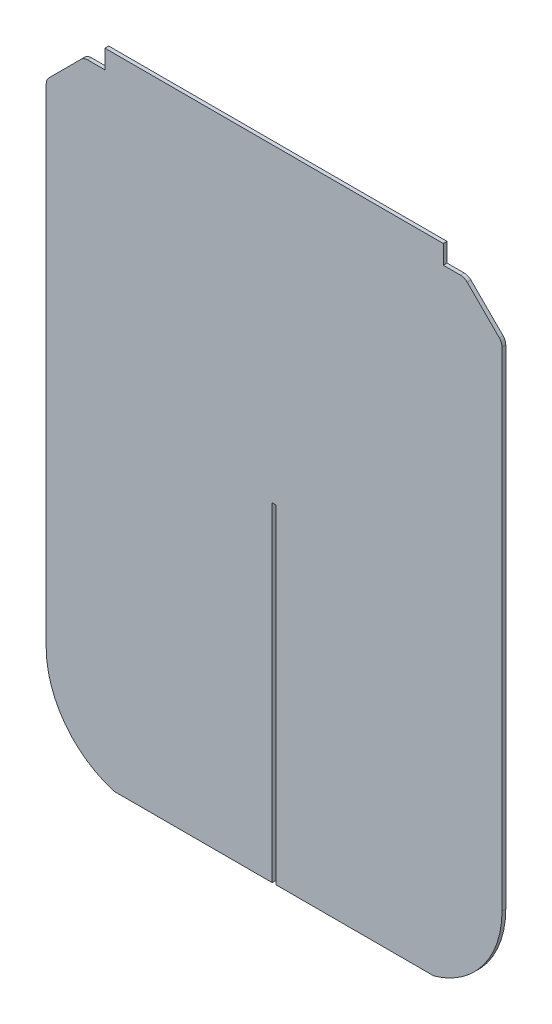
ISO-10303-21;
HEADER;
FILE_DESCRIPTION(('STEP AP214'),'2;1');
FILE_NAME('part.step','',(''),(''),'','','');
FILE_SCHEMA(('AUTOMOTIVE_DESIGN { 1 0 10303 214 1 1 1 1 }'));
ENDSEC;
DATA;
#1=APPLICATION_CONTEXT('core data for automotive mechanical design processes');
#2=APPLICATION_PROTOCOL_DEFINITION('international standard','automotive_design',2000,#1);
#3=PRODUCT_CONTEXT('',#1,'mechanical');
#4=PRODUCT('Part','Part','',(#3));
#5=PRODUCT_RELATED_PRODUCT_CATEGORY('part','',(#4));
#6=PRODUCT_DEFINITION_FORMATION('','',#4);
#7=PRODUCT_DEFINITION_CONTEXT('part definition',#1,'design');
#8=PRODUCT_DEFINITION('design','',#6,#7);
#9=PRODUCT_DEFINITION_SHAPE('','',#8);
#10=(LENGTH_UNIT() NAMED_UNIT(*) SI_UNIT(.MILLI.,.METRE.));
#11=(NAMED_UNIT(*) PLANE_ANGLE_UNIT() SI_UNIT($,.RADIAN.));
#12=(NAMED_UNIT(*) SI_UNIT($,.STERADIAN.) SOLID_ANGLE_UNIT());
#13=UNCERTAINTY_MEASURE_WITH_UNIT(LENGTH_MEASURE(1.E-05),#10,'distance_accuracy_value','');
#14=(GEOMETRIC_REPRESENTATION_CONTEXT(3) GLOBAL_UNCERTAINTY_ASSIGNED_CONTEXT((#13)) GLOBAL_UNIT_ASSIGNED_CONTEXT((#10,
#11,#12)) REPRESENTATION_CONTEXT('',''));
#15=CARTESIAN_POINT('',(0.,0.,0.));
#16=DIRECTION('',(0.,0.,1.));
#17=DIRECTION('',(1.,0.,0.));
#18=AXIS2_PLACEMENT_3D('',#15,#16,#17);
#19=CARTESIAN_POINT('',(12.5,132.,0.8));
#20=DIRECTION('',(1.,0.,0.));
#21=DIRECTION('',(0.,0.,-1.));
#22=AXIS2_PLACEMENT_3D('',#19,#20,#21);
#23=PLANE('',#22);
#24=DIRECTION('',(0.,-1.,0.));
#25=VECTOR('',#24,1.);
#26=CARTESIAN_POINT('',(12.5,132.,0.));
#27=LINE('',#26,#25);
#28=CARTESIAN_POINT('',(12.5,136.,0.));
#29=VERTEX_POINT('',#28);
#30=CARTESIAN_POINT('',(12.5,132.,0.));
#31=VERTEX_POINT('',#30);
#32=EDGE_CURVE('E208',#29,#31,#27,.T.);
#33=ORIENTED_EDGE('',*,*,#32,.T.);
#34=DIRECTION('',(0.,0.,-1.));
#35=VECTOR('',#34,1.);
#36=CARTESIAN_POINT('',(12.5,132.,0.8));
#37=LINE('',#36,#35);
#38=CARTESIAN_POINT('',(12.5,132.,0.8));
#39=VERTEX_POINT('',#38);
#40=EDGE_CURVE('E188',#39,#31,#37,.T.);
#41=ORIENTED_EDGE('',*,*,#40,.F.);
#42=DIRECTION('',(0.,-1.,0.));
#43=VECTOR('',#42,1.);
#44=CARTESIAN_POINT('',(12.5,132.,0.8));
#45=LINE('',#44,#43);
#46=CARTESIAN_POINT('',(12.5,136.,0.8));
#47=VERTEX_POINT('',#46);
#48=EDGE_CURVE('E195',#47,#39,#45,.T.);
#49=ORIENTED_EDGE('',*,*,#48,.F.);
#50=DIRECTION('',(0.,0.,-1.));
#51=VECTOR('',#50,1.);
#52=CARTESIAN_POINT('',(12.5,136.,0.8));
#53=LINE('',#52,#51);
#54=EDGE_CURVE('E292',#47,#29,#53,.T.);
#55=ORIENTED_EDGE('',*,*,#54,.T.);
#56=EDGE_LOOP('',(#33,#41,#49,#55));
#57=FACE_BOUND('',#56,.T.);
#58=ADVANCED_FACE('F45',(#57),#23,.F.);
#59=CARTESIAN_POINT('',(8.,132.,0.8));
#60=DIRECTION('',(0.,-1.,0.));
#61=DIRECTION('',(0.,0.,-1.));
#62=AXIS2_PLACEMENT_3D('',#59,#60,#61);
#63=PLANE('',#62);
#64=DIRECTION('',(-1.,0.,0.));
#65=VECTOR('',#64,1.);
#66=CARTESIAN_POINT('',(8.,132.,0.));
#67=LINE('',#66,#65);
#68=CARTESIAN_POINT('',(8.82842712474618,132.,0.));
#69=VERTEX_POINT('',#68);
#70=EDGE_CURVE('E395',#31,#69,#67,.T.);
#71=ORIENTED_EDGE('',*,*,#70,.T.);
#72=DIRECTION('',(0.,0.,-1.));
#73=VECTOR('',#72,1.);
#74=CARTESIAN_POINT('',(8.82842712474618,132.,0.8));
#75=LINE('',#74,#73);
#76=CARTESIAN_POINT('',(8.82842712474618,132.,0.8));
#77=VERTEX_POINT('',#76);
#78=EDGE_CURVE('E191',#69,#77,#75,.F.);
#79=ORIENTED_EDGE('',*,*,#78,.T.);
#80=DIRECTION('',(-1.,0.,0.));
#81=VECTOR('',#80,1.);
#82=CARTESIAN_POINT('',(8.,132.,0.8));
#83=LINE('',#82,#81);
#84=EDGE_CURVE('E183',#39,#77,#83,.T.);
#85=ORIENTED_EDGE('',*,*,#84,.F.);
#86=ORIENTED_EDGE('',*,*,#40,.T.);
#87=EDGE_LOOP('',(#71,#79,#85,#86));
#88=FACE_BOUND('',#87,.T.);
#89=ADVANCED_FACE('F186',(#88),#63,.F.);
#90=CARTESIAN_POINT('',(0.,124.,0.8));
#91=DIRECTION('',(0.707106781186548,-0.707106781186547,0.));
#92=DIRECTION('',(0.707106781186547,0.707106781186548,0.));
#93=AXIS2_PLACEMENT_3D('',#90,#91,#92);
#94=PLANE('',#93);
#95=DIRECTION('',(-0.707106781186547,-0.707106781186548,0.));
#96=VECTOR('',#95,1.);
#97=CARTESIAN_POINT('',(0.,124.,0.8));
#98=LINE('',#97,#96);
#99=CARTESIAN_POINT('',(7.41421356237309,131.414213562373,0.8));
#100=VERTEX_POINT('',#99);
#101=CARTESIAN_POINT('',(0.585786437626899,124.585786437627,0.8));
#102=VERTEX_POINT('',#101);
#103=EDGE_CURVE('E194',#100,#102,#98,.T.);
#104=ORIENTED_EDGE('',*,*,#103,.F.);
#105=DIRECTION('',(0.,0.,-1.));
#106=VECTOR('',#105,1.);
#107=CARTESIAN_POINT('',(7.41421356237309,131.414213562373,0.8));
#108=LINE('',#107,#106);
#109=CARTESIAN_POINT('',(7.41421356237309,131.414213562373,0.));
#110=VERTEX_POINT('',#109);
#111=EDGE_CURVE('E215',#100,#110,#108,.T.);
#112=ORIENTED_EDGE('',*,*,#111,.T.);
#113=DIRECTION('',(-0.707106781186547,-0.707106781186548,0.));
#114=VECTOR('',#113,1.);
#115=CARTESIAN_POINT('',(0.,124.,0.));
#116=LINE('',#115,#114);
#117=CARTESIAN_POINT('',(0.585786437626899,124.585786437627,0.));
#118=VERTEX_POINT('',#117);
#119=EDGE_CURVE('E398',#110,#118,#116,.T.);
#120=ORIENTED_EDGE('',*,*,#119,.T.);
#121=DIRECTION('',(0.,0.,-1.));
#122=VECTOR('',#121,1.);
#123=CARTESIAN_POINT('',(0.5857864376269,124.585786437627,0.8));
#124=LINE('',#123,#122);
#125=EDGE_CURVE('E210',#118,#102,#124,.F.);
#126=ORIENTED_EDGE('',*,*,#125,.T.);
#127=EDGE_LOOP('',(#104,#112,#120,#126));
#128=FACE_BOUND('',#127,.T.);
#129=ADVANCED_FACE('F457',(#128),#94,.F.);
#130=CARTESIAN_POINT('',(0.,19.2288845230294,0.8));
#131=DIRECTION('',(1.,0.,0.));
#132=DIRECTION('',(0.,0.,-1.));
#133=AXIS2_PLACEMENT_3D('',#130,#131,#132);
#134=PLANE('',#133);
#135=DIRECTION('',(0.,-1.,0.));
#136=VECTOR('',#135,1.);
#137=CARTESIAN_POINT('',(0.,19.2288845230294,0.8));
#138=LINE('',#137,#136);
#139=CARTESIAN_POINT('',(0.,123.171572875254,0.8));
#140=VERTEX_POINT('',#139);
#141=CARTESIAN_POINT('',(0.,19.2288845230294,0.8));
#142=VERTEX_POINT('',#141);
#143=EDGE_CURVE('E410',#140,#142,#138,.T.);
#144=ORIENTED_EDGE('',*,*,#143,.F.);
#145=DIRECTION('',(0.,0.,-1.));
#146=VECTOR('',#145,1.);
#147=CARTESIAN_POINT('',(0.,123.171572875254,0.8));
#148=LINE('',#147,#146);
#149=CARTESIAN_POINT('',(0.,123.171572875254,0.));
#150=VERTEX_POINT('',#149);
#151=EDGE_CURVE('E250',#140,#150,#148,.T.);
#152=ORIENTED_EDGE('',*,*,#151,.T.);
#153=DIRECTION('',(0.,-1.,0.));
#154=VECTOR('',#153,1.);
#155=CARTESIAN_POINT('',(0.,19.2288845230294,0.));
#156=LINE('',#155,#154);
#157=CARTESIAN_POINT('',(0.,19.2288845230294,0.));
#158=VERTEX_POINT('',#157);
#159=EDGE_CURVE('E350',#150,#158,#156,.T.);
#160=ORIENTED_EDGE('',*,*,#159,.T.);
#161=DIRECTION('',(0.,0.,-1.));
#162=VECTOR('',#161,1.);
#163=CARTESIAN_POINT('',(0.,19.2288845230294,0.8));
#164=LINE('',#163,#162);
#165=EDGE_CURVE('E211',#142,#158,#164,.T.);
#166=ORIENTED_EDGE('',*,*,#165,.F.);
#167=EDGE_LOOP('',(#144,#152,#160,#166));
#168=FACE_BOUND('',#167,.T.);
#169=ADVANCED_FACE('F405',(#168),#134,.F.);
#170=CARTESIAN_POINT('',(20.,19.2288845230294,0.8));
#171=DIRECTION('',(0.,0.,-1.));
#172=DIRECTION('',(-1.,0.,0.));
#173=AXIS2_PLACEMENT_3D('',#170,#171,#172);
#174=CYLINDRICAL_SURFACE('',#173,20.);
#175=CARTESIAN_POINT('',(20.,19.2288845230294,0.));
#176=DIRECTION('',(0.,0.,1.));
#177=DIRECTION('',(1.,0.,0.));
#178=AXIS2_PLACEMENT_3D('',#175,#176,#177);
#179=CIRCLE('',#178,20.);
#180=CARTESIAN_POINT('',(14.5,0.,0.));
#181=VERTEX_POINT('',#180);
#182=EDGE_CURVE('E341',#158,#181,#179,.T.);
#183=ORIENTED_EDGE('',*,*,#182,.T.);
#184=DIRECTION('',(0.,0.,-1.));
#185=VECTOR('',#184,1.);
#186=CARTESIAN_POINT('',(14.5,0.,0.8));
#187=LINE('',#186,#185);
#188=CARTESIAN_POINT('',(14.5,0.,0.8));
#189=VERTEX_POINT('',#188);
#190=EDGE_CURVE('E218',#189,#181,#187,.T.);
#191=ORIENTED_EDGE('',*,*,#190,.F.);
#192=CARTESIAN_POINT('',(20.,19.2288845230294,0.8));
#193=DIRECTION('',(0.,0.,1.));
#194=DIRECTION('',(1.,0.,0.));
#195=AXIS2_PLACEMENT_3D('',#192,#193,#194);
#196=CIRCLE('',#195,20.);
#197=EDGE_CURVE('E408',#142,#189,#196,.T.);
#198=ORIENTED_EDGE('',*,*,#197,.F.);
#199=ORIENTED_EDGE('',*,*,#165,.T.);
#200=EDGE_LOOP('',(#183,#191,#198,#199));
#201=FACE_BOUND('',#200,.T.);
#202=ADVANCED_FACE('F407',(#201),#174,.T.);
#203=CARTESIAN_POINT('',(14.5,0.,0.8));
#204=DIRECTION('',(0.,1.,0.));
#205=DIRECTION('',(0.,0.,1.));
#206=AXIS2_PLACEMENT_3D('',#203,#204,#205);
#207=PLANE('',#206);
#208=DIRECTION('',(1.,0.,0.));
#209=VECTOR('',#208,1.);
#210=CARTESIAN_POINT('',(14.5,0.,0.));
#211=LINE('',#210,#209);
#212=CARTESIAN_POINT('',(48.1,0.,0.));
#213=VERTEX_POINT('',#212);
#214=EDGE_CURVE('E334',#181,#213,#211,.T.);
#215=ORIENTED_EDGE('',*,*,#214,.T.);
#216=DIRECTION('',(0.,0.,-1.));
#217=VECTOR('',#216,1.);
#218=CARTESIAN_POINT('',(48.1,0.,0.8));
#219=LINE('',#218,#217);
#220=CARTESIAN_POINT('',(48.1,0.,0.8));
#221=VERTEX_POINT('',#220);
#222=EDGE_CURVE('E323',#221,#213,#219,.T.);
#223=ORIENTED_EDGE('',*,*,#222,.F.);
#224=DIRECTION('',(1.,0.,0.));
#225=VECTOR('',#224,1.);
#226=CARTESIAN_POINT('',(14.5,0.,0.8));
#227=LINE('',#226,#225);
#228=EDGE_CURVE('E335',#189,#221,#227,.T.);
#229=ORIENTED_EDGE('',*,*,#228,.F.);
#230=ORIENTED_EDGE('',*,*,#190,.T.);
#231=EDGE_LOOP('',(#215,#223,#229,#230));
#232=FACE_BOUND('',#231,.T.);
#233=ADVANCED_FACE('F332',(#232),#207,.F.);
#234=CARTESIAN_POINT('',(48.1,70.,0.8));
#235=DIRECTION('',(-1.,0.,0.));
#236=DIRECTION('',(0.,-1.,0.));
#237=AXIS2_PLACEMENT_3D('',#234,#235,#236);
#238=PLANE('',#237);
#239=DIRECTION('',(0.,1.,0.));
#240=VECTOR('',#239,1.);
#241=CARTESIAN_POINT('',(48.1,70.,0.));
#242=LINE('',#241,#240);
#243=CARTESIAN_POINT('',(48.1,70.,0.));
#244=VERTEX_POINT('',#243);
#245=EDGE_CURVE('E343',#213,#244,#242,.T.);
#246=ORIENTED_EDGE('',*,*,#245,.T.);
#247=DIRECTION('',(0.,0.,-1.));
#248=VECTOR('',#247,1.);
#249=CARTESIAN_POINT('',(48.1,70.,0.8));
#250=LINE('',#249,#248);
#251=CARTESIAN_POINT('',(48.1,70.,0.8));
#252=VERTEX_POINT('',#251);
#253=EDGE_CURVE('E319',#252,#244,#250,.T.);
#254=ORIENTED_EDGE('',*,*,#253,.F.);
#255=DIRECTION('',(0.,1.,0.));
#256=VECTOR('',#255,1.);
#257=CARTESIAN_POINT('',(48.1,70.,0.8));
#258=LINE('',#257,#256);
#259=EDGE_CURVE('E414',#221,#252,#258,.T.);
#260=ORIENTED_EDGE('',*,*,#259,.F.);
#261=ORIENTED_EDGE('',*,*,#222,.T.);
#262=EDGE_LOOP('',(#246,#254,#260,#261));
#263=FACE_BOUND('',#262,.T.);
#264=ADVANCED_FACE('F442',(#263),#238,.F.);
#265=CARTESIAN_POINT('',(48.1,70.,0.8));
#266=DIRECTION('',(0.,1.,0.));
#267=DIRECTION('',(0.,0.,1.));
#268=AXIS2_PLACEMENT_3D('',#265,#266,#267);
#269=PLANE('',#268);
#270=DIRECTION('',(1.,0.,0.));
#271=VECTOR('',#270,1.);
#272=CARTESIAN_POINT('',(48.1,70.,0.));
#273=LINE('',#272,#271);
#274=CARTESIAN_POINT('',(48.9,70.,0.));
#275=VERTEX_POINT('',#274);
#276=EDGE_CURVE('E348',#244,#275,#273,.T.);
#277=ORIENTED_EDGE('',*,*,#276,.T.);
#278=DIRECTION('',(0.,0.,-1.));
#279=VECTOR('',#278,1.);
#280=CARTESIAN_POINT('',(48.9,70.,0.8));
#281=LINE('',#280,#279);
#282=CARTESIAN_POINT('',(48.9,70.,0.8));
#283=VERTEX_POINT('',#282);
#284=EDGE_CURVE('E315',#283,#275,#281,.T.);
#285=ORIENTED_EDGE('',*,*,#284,.F.);
#286=DIRECTION('',(1.,0.,0.));
#287=VECTOR('',#286,1.);
#288=CARTESIAN_POINT('',(48.1,70.,0.8));
#289=LINE('',#288,#287);
#290=EDGE_CURVE('E421',#252,#283,#289,.T.);
#291=ORIENTED_EDGE('',*,*,#290,.F.);
#292=ORIENTED_EDGE('',*,*,#253,.T.);
#293=EDGE_LOOP('',(#277,#285,#291,#292));
#294=FACE_BOUND('',#293,.T.);
#295=ADVANCED_FACE('F438',(#294),#269,.F.);
#296=CARTESIAN_POINT('',(48.9,70.,0.8));
#297=DIRECTION('',(1.,0.,0.));
#298=DIRECTION('',(0.,1.,0.));
#299=AXIS2_PLACEMENT_3D('',#296,#297,#298);
#300=PLANE('',#299);
#301=DIRECTION('',(0.,-1.,0.));
#302=VECTOR('',#301,1.);
#303=CARTESIAN_POINT('',(48.9,70.,0.));
#304=LINE('',#303,#302);
#305=CARTESIAN_POINT('',(48.9,0.,0.));
#306=VERTEX_POINT('',#305);
#307=EDGE_CURVE('E356',#275,#306,#304,.T.);
#308=ORIENTED_EDGE('',*,*,#307,.T.);
#309=DIRECTION('',(0.,0.,-1.));
#310=VECTOR('',#309,1.);
#311=CARTESIAN_POINT('',(48.9,0.,0.8));
#312=LINE('',#311,#310);
#313=CARTESIAN_POINT('',(48.9,0.,0.8));
#314=VERTEX_POINT('',#313);
#315=EDGE_CURVE('E311',#314,#306,#312,.T.);
#316=ORIENTED_EDGE('',*,*,#315,.F.);
#317=DIRECTION('',(0.,-1.,0.));
#318=VECTOR('',#317,1.);
#319=CARTESIAN_POINT('',(48.9,70.,0.8));
#320=LINE('',#319,#318);
#321=EDGE_CURVE('E424',#283,#314,#320,.T.);
#322=ORIENTED_EDGE('',*,*,#321,.F.);
#323=ORIENTED_EDGE('',*,*,#284,.T.);
#324=EDGE_LOOP('',(#308,#316,#322,#323));
#325=FACE_BOUND('',#324,.T.);
#326=ADVANCED_FACE('F434',(#325),#300,.F.);
#327=CARTESIAN_POINT('',(48.9,0.,0.8));
#328=DIRECTION('',(0.,1.,0.));
#329=DIRECTION('',(0.,0.,1.));
#330=AXIS2_PLACEMENT_3D('',#327,#328,#329);
#331=PLANE('',#330);
#332=DIRECTION('',(1.,0.,0.));
#333=VECTOR('',#332,1.);
#334=CARTESIAN_POINT('',(48.9,0.,0.));
#335=LINE('',#334,#333);
#336=CARTESIAN_POINT('',(82.5,0.,0.));
#337=VERTEX_POINT('',#336);
#338=EDGE_CURVE('E359',#306,#337,#335,.T.);
#339=ORIENTED_EDGE('',*,*,#338,.T.);
#340=DIRECTION('',(0.,0.,-1.));
#341=VECTOR('',#340,1.);
#342=CARTESIAN_POINT('',(82.5,0.,0.8));
#343=LINE('',#342,#341);
#344=CARTESIAN_POINT('',(82.5,0.,0.8));
#345=VERTEX_POINT('',#344);
#346=EDGE_CURVE('E307',#345,#337,#343,.T.);
#347=ORIENTED_EDGE('',*,*,#346,.F.);
#348=DIRECTION('',(1.,0.,0.));
#349=VECTOR('',#348,1.);
#350=CARTESIAN_POINT('',(48.9,0.,0.8));
#351=LINE('',#350,#349);
#352=EDGE_CURVE('E382',#314,#345,#351,.T.);
#353=ORIENTED_EDGE('',*,*,#352,.F.);
#354=ORIENTED_EDGE('',*,*,#315,.T.);
#355=EDGE_LOOP('',(#339,#347,#353,#354));
#356=FACE_BOUND('',#355,.T.);
#357=ADVANCED_FACE('F431',(#356),#331,.F.);
#358=CARTESIAN_POINT('',(77.,19.2288845230294,0.8));
#359=DIRECTION('',(0.,0.,-1.));
#360=DIRECTION('',(-1.,0.,0.));
#361=AXIS2_PLACEMENT_3D('',#358,#359,#360);
#362=CYLINDRICAL_SURFACE('',#361,20.);
#363=CARTESIAN_POINT('',(77.,19.2288845230294,0.));
#364=DIRECTION('',(0.,0.,1.));
#365=DIRECTION('',(1.,0.,0.));
#366=AXIS2_PLACEMENT_3D('',#363,#364,#365);
#367=CIRCLE('',#366,20.);
#368=CARTESIAN_POINT('',(97.,19.2288845230294,0.));
#369=VERTEX_POINT('',#368);
#370=EDGE_CURVE('E283',#337,#369,#367,.T.);
#371=ORIENTED_EDGE('',*,*,#370,.T.);
#372=DIRECTION('',(0.,0.,-1.));
#373=VECTOR('',#372,1.);
#374=CARTESIAN_POINT('',(97.,19.2288845230294,0.8));
#375=LINE('',#374,#373);
#376=CARTESIAN_POINT('',(97.,19.2288845230294,0.8));
#377=VERTEX_POINT('',#376);
#378=EDGE_CURVE('E303',#377,#369,#375,.T.);
#379=ORIENTED_EDGE('',*,*,#378,.F.);
#380=CARTESIAN_POINT('',(77.,19.2288845230294,0.8));
#381=DIRECTION('',(0.,0.,1.));
#382=DIRECTION('',(1.,0.,0.));
#383=AXIS2_PLACEMENT_3D('',#380,#381,#382);
#384=CIRCLE('',#383,20.);
#385=EDGE_CURVE('E376',#345,#377,#384,.T.);
#386=ORIENTED_EDGE('',*,*,#385,.F.);
#387=ORIENTED_EDGE('',*,*,#346,.T.);
#388=EDGE_LOOP('',(#371,#379,#386,#387));
#389=FACE_BOUND('',#388,.T.);
#390=ADVANCED_FACE('F365',(#389),#362,.T.);
#391=CARTESIAN_POINT('',(97.,19.2288845230294,0.8));
#392=DIRECTION('',(-1.,0.,0.));
#393=DIRECTION('',(0.,-1.,0.));
#394=AXIS2_PLACEMENT_3D('',#391,#392,#393);
#395=PLANE('',#394);
#396=DIRECTION('',(0.,1.,0.));
#397=VECTOR('',#396,1.);
#398=CARTESIAN_POINT('',(97.,19.2288845230294,0.));
#399=LINE('',#398,#397);
#400=CARTESIAN_POINT('',(97.,123.171572875254,0.));
#401=VERTEX_POINT('',#400);
#402=EDGE_CURVE('E277',#369,#401,#399,.T.);
#403=ORIENTED_EDGE('',*,*,#402,.T.);
#404=DIRECTION('',(0.,0.,-1.));
#405=VECTOR('',#404,1.);
#406=CARTESIAN_POINT('',(97.,123.171572875254,0.8));
#407=LINE('',#406,#405);
#408=CARTESIAN_POINT('',(97.,123.171572875254,0.8));
#409=VERTEX_POINT('',#408);
#410=EDGE_CURVE('E11',#401,#409,#407,.F.);
#411=ORIENTED_EDGE('',*,*,#410,.T.);
#412=DIRECTION('',(0.,1.,0.));
#413=VECTOR('',#412,1.);
#414=CARTESIAN_POINT('',(97.,19.2288845230294,0.8));
#415=LINE('',#414,#413);
#416=EDGE_CURVE('E374',#377,#409,#415,.T.);
#417=ORIENTED_EDGE('',*,*,#416,.F.);
#418=ORIENTED_EDGE('',*,*,#378,.T.);
#419=EDGE_LOOP('',(#403,#411,#417,#418));
#420=FACE_BOUND('',#419,.T.);
#421=ADVANCED_FACE('F371',(#420),#395,.F.);
#422=CARTESIAN_POINT('',(97.,124.,0.8));
#423=DIRECTION('',(-0.707106781186548,-0.707106781186548,0.));
#424=DIRECTION('',(0.707106781186548,-0.707106781186548,0.));
#425=AXIS2_PLACEMENT_3D('',#422,#423,#424);
#426=PLANE('',#425);
#427=DIRECTION('',(-0.707106781186547,0.707106781186547,0.));
#428=VECTOR('',#427,1.);
#429=CARTESIAN_POINT('',(97.,124.,0.));
#430=LINE('',#429,#428);
#431=CARTESIAN_POINT('',(96.4142135623731,124.585786437627,0.));
#432=VERTEX_POINT('',#431);
#433=CARTESIAN_POINT('',(89.5857864376269,131.414213562373,0.));
#434=VERTEX_POINT('',#433);
#435=EDGE_CURVE('E265',#432,#434,#430,.T.);
#436=ORIENTED_EDGE('',*,*,#435,.T.);
#437=DIRECTION('',(0.,0.,-1.));
#438=VECTOR('',#437,1.);
#439=CARTESIAN_POINT('',(89.5857864376269,131.414213562373,0.8));
#440=LINE('',#439,#438);
#441=CARTESIAN_POINT('',(89.5857864376269,131.414213562373,0.8));
#442=VERTEX_POINT('',#441);
#443=EDGE_CURVE('E54',#434,#442,#440,.F.);
#444=ORIENTED_EDGE('',*,*,#443,.T.);
#445=DIRECTION('',(-0.707106781186547,0.707106781186547,0.));
#446=VECTOR('',#445,1.);
#447=CARTESIAN_POINT('',(97.,124.,0.8));
#448=LINE('',#447,#446);
#449=CARTESIAN_POINT('',(96.4142135623731,124.585786437627,0.8));
#450=VERTEX_POINT('',#449);
#451=EDGE_CURVE('E266',#450,#442,#448,.T.);
#452=ORIENTED_EDGE('',*,*,#451,.F.);
#453=DIRECTION('',(0.,0.,-1.));
#454=VECTOR('',#453,1.);
#455=CARTESIAN_POINT('',(96.4142135623731,124.585786437627,0.8));
#456=LINE('',#455,#454);
#457=EDGE_CURVE('E258',#450,#432,#456,.T.);
#458=ORIENTED_EDGE('',*,*,#457,.T.);
#459=EDGE_LOOP('',(#436,#444,#452,#458));
#460=FACE_BOUND('',#459,.T.);
#461=ADVANCED_FACE('F264',(#460),#426,.F.);
#462=CARTESIAN_POINT('',(84.5,132.,0.8));
#463=DIRECTION('',(0.,-1.,0.));
#464=DIRECTION('',(0.,0.,-1.));
#465=AXIS2_PLACEMENT_3D('',#462,#463,#464);
#466=PLANE('',#465);
#467=DIRECTION('',(-1.,0.,0.));
#468=VECTOR('',#467,1.);
#469=CARTESIAN_POINT('',(84.5,132.,0.8));
#470=LINE('',#469,#468);
#471=CARTESIAN_POINT('',(88.1715728752538,132.,0.8));
#472=VERTEX_POINT('',#471);
#473=CARTESIAN_POINT('',(84.5,132.,0.8));
#474=VERTEX_POINT('',#473);
#475=EDGE_CURVE('E380',#472,#474,#470,.T.);
#476=ORIENTED_EDGE('',*,*,#475,.F.);
#477=DIRECTION('',(0.,0.,-1.));
#478=VECTOR('',#477,1.);
#479=CARTESIAN_POINT('',(88.1715728752538,132.,0.8));
#480=LINE('',#479,#478);
#481=CARTESIAN_POINT('',(88.1715728752538,132.,0.));
#482=VERTEX_POINT('',#481);
#483=EDGE_CURVE('E254',#472,#482,#480,.T.);
#484=ORIENTED_EDGE('',*,*,#483,.T.);
#485=DIRECTION('',(-1.,0.,0.));
#486=VECTOR('',#485,1.);
#487=CARTESIAN_POINT('',(84.5,132.,0.));
#488=LINE('',#487,#486);
#489=CARTESIAN_POINT('',(84.5,132.,0.));
#490=VERTEX_POINT('',#489);
#491=EDGE_CURVE('E276',#482,#490,#488,.T.);
#492=ORIENTED_EDGE('',*,*,#491,.T.);
#493=DIRECTION('',(0.,0.,-1.));
#494=VECTOR('',#493,1.);
#495=CARTESIAN_POINT('',(84.5,132.,0.8));
#496=LINE('',#495,#494);
#497=EDGE_CURVE('E299',#474,#490,#496,.T.);
#498=ORIENTED_EDGE('',*,*,#497,.F.);
#499=EDGE_LOOP('',(#476,#484,#492,#498));
#500=FACE_BOUND('',#499,.T.);
#501=ADVANCED_FACE('F476',(#500),#466,.F.);
#502=CARTESIAN_POINT('',(84.5,132.,0.8));
#503=DIRECTION('',(-1.,0.,0.));
#504=DIRECTION('',(0.,0.,1.));
#505=AXIS2_PLACEMENT_3D('',#502,#503,#504);
#506=PLANE('',#505);
#507=DIRECTION('',(0.,1.,0.));
#508=VECTOR('',#507,1.);
#509=CARTESIAN_POINT('',(84.5,132.,0.));
#510=LINE('',#509,#508);
#511=CARTESIAN_POINT('',(84.5,136.,0.));
#512=VERTEX_POINT('',#511);
#513=EDGE_CURVE('E281',#490,#512,#510,.T.);
#514=ORIENTED_EDGE('',*,*,#513,.T.);
#515=DIRECTION('',(0.,0.,-1.));
#516=VECTOR('',#515,1.);
#517=CARTESIAN_POINT('',(84.5,136.,0.8));
#518=LINE('',#517,#516);
#519=CARTESIAN_POINT('',(84.5,136.,0.8));
#520=VERTEX_POINT('',#519);
#521=EDGE_CURVE('E295',#520,#512,#518,.T.);
#522=ORIENTED_EDGE('',*,*,#521,.F.);
#523=DIRECTION('',(0.,1.,0.));
#524=VECTOR('',#523,1.);
#525=CARTESIAN_POINT('',(84.5,132.,0.8));
#526=LINE('',#525,#524);
#527=EDGE_CURVE('E388',#474,#520,#526,.T.);
#528=ORIENTED_EDGE('',*,*,#527,.F.);
#529=ORIENTED_EDGE('',*,*,#497,.T.);
#530=EDGE_LOOP('',(#514,#522,#528,#529));
#531=FACE_BOUND('',#530,.T.);
#532=ADVANCED_FACE('F481',(#531),#506,.F.);
#533=CARTESIAN_POINT('',(12.5,136.,0.8));
#534=DIRECTION('',(0.,-1.,0.));
#535=DIRECTION('',(0.,0.,-1.));
#536=AXIS2_PLACEMENT_3D('',#533,#534,#535);
#537=PLANE('',#536);
#538=DIRECTION('',(-1.,0.,0.));
#539=VECTOR('',#538,1.);
#540=CARTESIAN_POINT('',(12.5,136.,0.));
#541=LINE('',#540,#539);
#542=EDGE_CURVE('E205',#512,#29,#541,.T.);
#543=ORIENTED_EDGE('',*,*,#542,.T.);
#544=ORIENTED_EDGE('',*,*,#54,.F.);
#545=DIRECTION('',(-1.,0.,0.));
#546=VECTOR('',#545,1.);
#547=CARTESIAN_POINT('',(45.9398654309698,136.,0.8));
#548=LINE('',#547,#546);
#549=EDGE_CURVE('E200',#520,#47,#548,.T.);
#550=ORIENTED_EDGE('',*,*,#549,.F.);
#551=ORIENTED_EDGE('',*,*,#521,.T.);
#552=EDGE_LOOP('',(#543,#544,#550,#551));
#553=FACE_BOUND('',#552,.T.);
#554=ADVANCED_FACE('F484',(#553),#537,.F.);
#555=CARTESIAN_POINT('',(77.,19.2288845230294,0.8));
#556=DIRECTION('',(0.,0.,1.));
#557=DIRECTION('',(1.,0.,0.));
#558=AXIS2_PLACEMENT_3D('',#555,#556,#557);
#559=PLANE('',#558);
#560=ORIENTED_EDGE('',*,*,#84,.T.);
#561=CARTESIAN_POINT('',(8.82842712474618,130.,0.8));
#562=DIRECTION('',(0.,0.,1.));
#563=DIRECTION('',(1.,0.,0.));
#564=AXIS2_PLACEMENT_3D('',#561,#562,#563);
#565=CIRCLE('',#564,2.);
#566=EDGE_CURVE('E247',#77,#100,#565,.T.);
#567=ORIENTED_EDGE('',*,*,#566,.T.);
#568=ORIENTED_EDGE('',*,*,#103,.T.);
#569=CARTESIAN_POINT('',(2.,123.171572875254,0.8));
#570=DIRECTION('',(0.,0.,1.));
#571=DIRECTION('',(1.,0.,0.));
#572=AXIS2_PLACEMENT_3D('',#569,#570,#571);
#573=CIRCLE('',#572,2.);
#574=EDGE_CURVE('E244',#102,#140,#573,.T.);
#575=ORIENTED_EDGE('',*,*,#574,.T.);
#576=ORIENTED_EDGE('',*,*,#143,.T.);
#577=ORIENTED_EDGE('',*,*,#197,.T.);
#578=ORIENTED_EDGE('',*,*,#228,.T.);
#579=ORIENTED_EDGE('',*,*,#259,.T.);
#580=ORIENTED_EDGE('',*,*,#290,.T.);
#581=ORIENTED_EDGE('',*,*,#321,.T.);
#582=ORIENTED_EDGE('',*,*,#352,.T.);
#583=ORIENTED_EDGE('',*,*,#385,.T.);
#584=ORIENTED_EDGE('',*,*,#416,.T.);
#585=CARTESIAN_POINT('',(95.,123.171572875254,0.8));
#586=DIRECTION('',(0.,0.,1.));
#587=DIRECTION('',(1.,0.,0.));
#588=AXIS2_PLACEMENT_3D('',#585,#586,#587);
#589=CIRCLE('',#588,2.);
#590=EDGE_CURVE('E239',#409,#450,#589,.T.);
#591=ORIENTED_EDGE('',*,*,#590,.T.);
#592=ORIENTED_EDGE('',*,*,#451,.T.);
#593=CARTESIAN_POINT('',(88.1715728752538,130.,0.8));
#594=DIRECTION('',(0.,0.,1.));
#595=DIRECTION('',(1.,0.,0.));
#596=AXIS2_PLACEMENT_3D('',#593,#594,#595);
#597=CIRCLE('',#596,2.);
#598=EDGE_CURVE('E61',#442,#472,#597,.T.);
#599=ORIENTED_EDGE('',*,*,#598,.T.);
#600=ORIENTED_EDGE('',*,*,#475,.T.);
#601=ORIENTED_EDGE('',*,*,#527,.T.);
#602=ORIENTED_EDGE('',*,*,#549,.T.);
#603=ORIENTED_EDGE('',*,*,#48,.T.);
#604=EDGE_LOOP('',(#560,#567,#568,#575,#576,#577,#578,#579,#580,#581,#582,#583,#584,#591,#592,
#599,#600,#601,#602,#603));
#605=FACE_BOUND('',#604,.T.);
#606=ADVANCED_FACE('F198',(#605),#559,.T.);
#607=CARTESIAN_POINT('',(77.,19.2288845230294,0.));
#608=DIRECTION('',(0.,0.,1.));
#609=DIRECTION('',(1.,0.,0.));
#610=AXIS2_PLACEMENT_3D('',#607,#608,#609);
#611=PLANE('',#610);
#612=ORIENTED_EDGE('',*,*,#119,.F.);
#613=CARTESIAN_POINT('',(8.82842712474618,130.,0.));
#614=DIRECTION('',(0.,0.,1.));
#615=DIRECTION('',(1.,0.,0.));
#616=AXIS2_PLACEMENT_3D('',#613,#614,#615);
#617=CIRCLE('',#616,2.);
#618=EDGE_CURVE('E234',#110,#69,#617,.F.);
#619=ORIENTED_EDGE('',*,*,#618,.T.);
#620=ORIENTED_EDGE('',*,*,#70,.F.);
#621=ORIENTED_EDGE('',*,*,#32,.F.);
#622=ORIENTED_EDGE('',*,*,#542,.F.);
#623=ORIENTED_EDGE('',*,*,#513,.F.);
#624=ORIENTED_EDGE('',*,*,#491,.F.);
#625=CARTESIAN_POINT('',(88.1715728752538,130.,0.));
#626=DIRECTION('',(0.,0.,1.));
#627=DIRECTION('',(1.,0.,0.));
#628=AXIS2_PLACEMENT_3D('',#625,#626,#627);
#629=CIRCLE('',#628,2.);
#630=EDGE_CURVE('E228',#482,#434,#629,.F.);
#631=ORIENTED_EDGE('',*,*,#630,.T.);
#632=ORIENTED_EDGE('',*,*,#435,.F.);
#633=CARTESIAN_POINT('',(95.,123.171572875254,0.));
#634=DIRECTION('',(0.,0.,1.));
#635=DIRECTION('',(1.,0.,0.));
#636=AXIS2_PLACEMENT_3D('',#633,#634,#635);
#637=CIRCLE('',#636,2.);
#638=EDGE_CURVE('E225',#432,#401,#637,.F.);
#639=ORIENTED_EDGE('',*,*,#638,.T.);
#640=ORIENTED_EDGE('',*,*,#402,.F.);
#641=ORIENTED_EDGE('',*,*,#370,.F.);
#642=ORIENTED_EDGE('',*,*,#338,.F.);
#643=ORIENTED_EDGE('',*,*,#307,.F.);
#644=ORIENTED_EDGE('',*,*,#276,.F.);
#645=ORIENTED_EDGE('',*,*,#245,.F.);
#646=ORIENTED_EDGE('',*,*,#214,.F.);
#647=ORIENTED_EDGE('',*,*,#182,.F.);
#648=ORIENTED_EDGE('',*,*,#159,.F.);
#649=CARTESIAN_POINT('',(2.,123.171572875254,0.));
#650=DIRECTION('',(0.,0.,1.));
#651=DIRECTION('',(1.,0.,0.));
#652=AXIS2_PLACEMENT_3D('',#649,#650,#651);
#653=CIRCLE('',#652,2.);
#654=EDGE_CURVE('E231',#150,#118,#653,.F.);
#655=ORIENTED_EDGE('',*,*,#654,.T.);
#656=EDGE_LOOP('',(#612,#619,#620,#621,#622,#623,#624,#631,#632,#639,#640,#641,#642,#643,#644,
#645,#646,#647,#648,#655));
#657=FACE_BOUND('',#656,.T.);
#658=ADVANCED_FACE('F271',(#657),#611,.F.);
#659=CARTESIAN_POINT('',(8.82842712474618,130.,0.8));
#660=DIRECTION('',(0.,0.,-1.));
#661=DIRECTION('',(-1.,0.,0.));
#662=AXIS2_PLACEMENT_3D('',#659,#660,#661);
#663=CYLINDRICAL_SURFACE('',#662,2.);
#664=ORIENTED_EDGE('',*,*,#566,.F.);
#665=ORIENTED_EDGE('',*,*,#78,.F.);
#666=ORIENTED_EDGE('',*,*,#618,.F.);
#667=ORIENTED_EDGE('',*,*,#111,.F.);
#668=EDGE_LOOP('',(#664,#665,#666,#667));
#669=FACE_BOUND('',#668,.T.);
#670=ADVANCED_FACE('F461',(#669),#663,.T.);
#671=CARTESIAN_POINT('',(2.,123.171572875254,0.8));
#672=DIRECTION('',(0.,0.,-1.));
#673=DIRECTION('',(-1.,0.,0.));
#674=AXIS2_PLACEMENT_3D('',#671,#672,#673);
#675=CYLINDRICAL_SURFACE('',#674,2.);
#676=ORIENTED_EDGE('',*,*,#574,.F.);
#677=ORIENTED_EDGE('',*,*,#125,.F.);
#678=ORIENTED_EDGE('',*,*,#654,.F.);
#679=ORIENTED_EDGE('',*,*,#151,.F.);
#680=EDGE_LOOP('',(#676,#677,#678,#679));
#681=FACE_BOUND('',#680,.T.);
#682=ADVANCED_FACE('F464',(#681),#675,.T.);
#683=CARTESIAN_POINT('',(88.1715728752538,130.,0.8));
#684=DIRECTION('',(0.,0.,-1.));
#685=DIRECTION('',(-1.,0.,0.));
#686=AXIS2_PLACEMENT_3D('',#683,#684,#685);
#687=CYLINDRICAL_SURFACE('',#686,2.);
#688=ORIENTED_EDGE('',*,*,#598,.F.);
#689=ORIENTED_EDGE('',*,*,#443,.F.);
#690=ORIENTED_EDGE('',*,*,#630,.F.);
#691=ORIENTED_EDGE('',*,*,#483,.F.);
#692=EDGE_LOOP('',(#688,#689,#690,#691));
#693=FACE_BOUND('',#692,.T.);
#694=ADVANCED_FACE('F467',(#693),#687,.T.);
#695=CARTESIAN_POINT('',(95.,123.171572875254,0.8));
#696=DIRECTION('',(0.,0.,-1.));
#697=DIRECTION('',(-1.,0.,0.));
#698=AXIS2_PLACEMENT_3D('',#695,#696,#697);
#699=CYLINDRICAL_SURFACE('',#698,2.);
#700=ORIENTED_EDGE('',*,*,#590,.F.);
#701=ORIENTED_EDGE('',*,*,#410,.F.);
#702=ORIENTED_EDGE('',*,*,#638,.F.);
#703=ORIENTED_EDGE('',*,*,#457,.F.);
#704=EDGE_LOOP('',(#700,#701,#702,#703));
#705=FACE_BOUND('',#704,.T.);
#706=ADVANCED_FACE('F47',(#705),#699,.T.);
#707=CLOSED_SHELL('',(#58,#89,#129,#169,#202,#233,#264,#295,#326,#357,#390,#421,#461,#501,#532,
#554,#606,#658,#670,#682,#694,#706));
#708=MANIFOLD_SOLID_BREP('B2',#707);
#709=ADVANCED_BREP_SHAPE_REPRESENTATION('',(#18,#708),#14);
#710=SHAPE_DEFINITION_REPRESENTATION(#9,#709);
ENDSEC;
END-ISO-10303-21;
